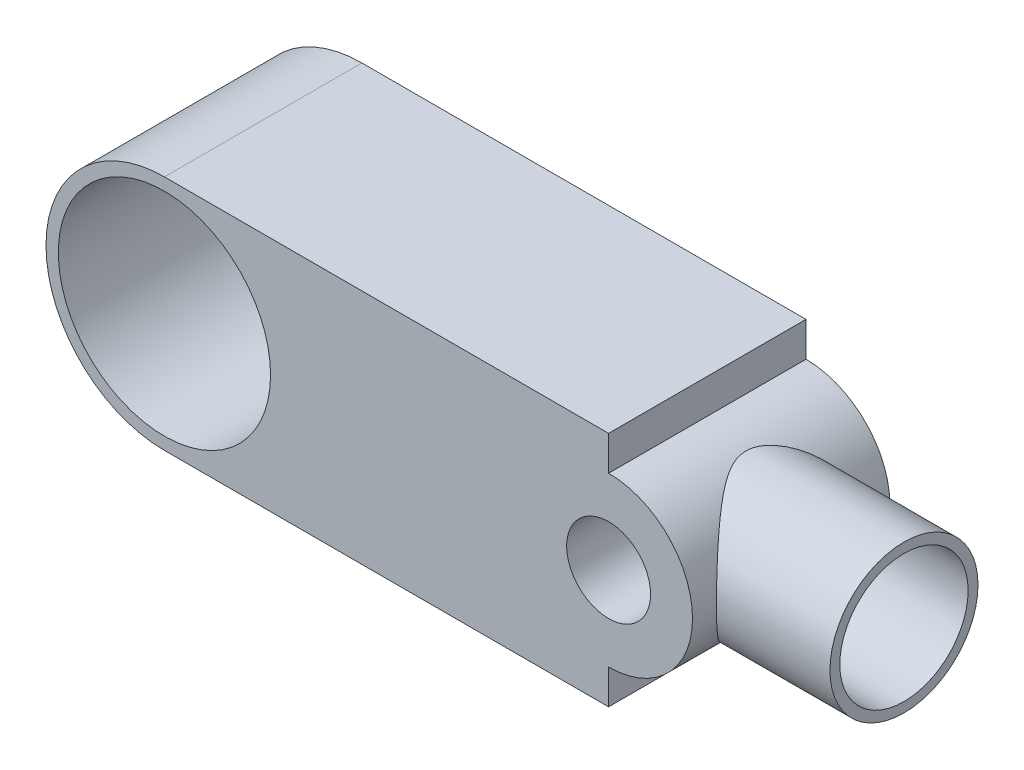
ISO-10303-21;
HEADER;
FILE_DESCRIPTION(('STEP AP214'),'2;1');
FILE_NAME('part.step','',(''),(''),'','','');
FILE_SCHEMA(('AUTOMOTIVE_DESIGN { 1 0 10303 214 1 1 1 1 }'));
ENDSEC;
DATA;
#1=APPLICATION_CONTEXT('core data for automotive mechanical design processes');
#2=APPLICATION_PROTOCOL_DEFINITION('international standard','automotive_design',2000,#1);
#3=PRODUCT_CONTEXT('',#1,'mechanical');
#4=PRODUCT('Part','Part','',(#3));
#5=PRODUCT_RELATED_PRODUCT_CATEGORY('part','',(#4));
#6=PRODUCT_DEFINITION_FORMATION('','',#4);
#7=PRODUCT_DEFINITION_CONTEXT('part definition',#1,'design');
#8=PRODUCT_DEFINITION('design','',#6,#7);
#9=PRODUCT_DEFINITION_SHAPE('','',#8);
#10=(LENGTH_UNIT() NAMED_UNIT(*) SI_UNIT(.MILLI.,.METRE.));
#11=(NAMED_UNIT(*) PLANE_ANGLE_UNIT() SI_UNIT($,.RADIAN.));
#12=(NAMED_UNIT(*) SI_UNIT($,.STERADIAN.) SOLID_ANGLE_UNIT());
#13=UNCERTAINTY_MEASURE_WITH_UNIT(LENGTH_MEASURE(1.E-05),#10,'distance_accuracy_value','');
#14=(GEOMETRIC_REPRESENTATION_CONTEXT(3) GLOBAL_UNCERTAINTY_ASSIGNED_CONTEXT((#13)) GLOBAL_UNIT_ASSIGNED_CONTEXT((#10,
#11,#12)) REPRESENTATION_CONTEXT('',''));
#15=CARTESIAN_POINT('',(0.,0.,0.));
#16=DIRECTION('',(0.,0.,1.));
#17=DIRECTION('',(1.,0.,0.));
#18=AXIS2_PLACEMENT_3D('',#15,#16,#17);
#19=CARTESIAN_POINT('',(0.,0.,40.));
#20=DIRECTION('',(0.,0.,-1.));
#21=DIRECTION('',(-1.,0.,0.));
#22=AXIS2_PLACEMENT_3D('',#19,#20,#21);
#23=CYLINDRICAL_SURFACE('',#22,17.);
#24=CARTESIAN_POINT('',(0.,0.,40.));
#25=DIRECTION('',(0.,0.,1.));
#26=DIRECTION('',(1.,0.,0.));
#27=AXIS2_PLACEMENT_3D('',#24,#25,#26);
#28=CIRCLE('',#27,17.);
#29=CARTESIAN_POINT('',(0.,-17.,40.));
#30=VERTEX_POINT('',#29);
#31=CARTESIAN_POINT('',(0.,17.,40.));
#32=VERTEX_POINT('',#31);
#33=EDGE_CURVE('E50',#30,#32,#28,.T.);
#34=ORIENTED_EDGE('',*,*,#33,.F.);
#35=DIRECTION('',(0.,0.,1.));
#36=VECTOR('',#35,1.);
#37=CARTESIAN_POINT('',(0.,-17.,0.));
#38=LINE('',#37,#36);
#39=CARTESIAN_POINT('',(0.,-17.,0.));
#40=VERTEX_POINT('',#39);
#41=EDGE_CURVE('E141',#40,#30,#38,.T.);
#42=ORIENTED_EDGE('',*,*,#41,.F.);
#43=CARTESIAN_POINT('',(0.,0.,0.));
#44=DIRECTION('',(0.,0.,1.));
#45=DIRECTION('',(1.,0.,0.));
#46=AXIS2_PLACEMENT_3D('',#43,#44,#45);
#47=CIRCLE('',#46,17.);
#48=CARTESIAN_POINT('',(0.,17.,0.));
#49=VERTEX_POINT('',#48);
#50=EDGE_CURVE('E45',#40,#49,#47,.T.);
#51=ORIENTED_EDGE('',*,*,#50,.T.);
#52=DIRECTION('',(0.,0.,1.));
#53=VECTOR('',#52,1.);
#54=CARTESIAN_POINT('',(0.,17.,0.));
#55=LINE('',#54,#53);
#56=EDGE_CURVE('E62',#49,#32,#55,.T.);
#57=ORIENTED_EDGE('',*,*,#56,.T.);
#58=EDGE_LOOP('',(#34,#42,#51,#57));
#59=FACE_BOUND('',#58,.T.);
#60=CARTESIAN_POINT('',(17.,0.,35.148533521579));
#61=CARTESIAN_POINT('',(16.9999991302981,-0.350062969028345,35.1485326365752));
#62=CARTESIAN_POINT('',(16.9891653444857,-0.700137947487223,35.1362576028503));
#63=CARTESIAN_POINT('',(16.9460807365506,-1.39725887284022,35.0874017384682));
#64=CARTESIAN_POINT('',(16.9138288534935,-1.74430466882253,35.0508197037761));
#65=CARTESIAN_POINT('',(16.8286230490111,-2.43264872335066,34.9540419460553));
#66=CARTESIAN_POINT('',(16.7756599565189,-2.77394436575743,34.8938357620491));
#67=CARTESIAN_POINT('',(16.6501724362022,-3.4480913826469,34.7509104252288));
#68=CARTESIAN_POINT('',(16.5776478083794,-3.78094267075591,34.6681910422382));
#69=CARTESIAN_POINT('',(16.4149921748408,-4.43402605306581,34.4821997809237));
#70=CARTESIAN_POINT('',(16.3249739977953,-4.75432399503505,34.379059535401));
#71=CARTESIAN_POINT('',(16.1286563009096,-5.38282947299204,34.1534129336591));
#72=CARTESIAN_POINT('',(16.0223571596618,-5.69103728991045,34.0309070277607));
#73=CARTESIAN_POINT('',(15.7951549284394,-6.29420048565358,33.7680522317252));
#74=CARTESIAN_POINT('',(15.6742496032193,-6.5891538265906,33.6277006104105));
#75=CARTESIAN_POINT('',(15.4195507686398,-7.16495750260025,33.3306571284931));
#76=CARTESIAN_POINT('',(15.2857544012181,-7.44580468911481,33.173961643667));
#77=CARTESIAN_POINT('',(14.9525647573555,-8.09955996417689,32.7815759695317));
#78=CARTESIAN_POINT('',(14.7479422301565,-8.46564473889133,32.5389147038629));
#79=CARTESIAN_POINT('',(14.3214041581488,-9.16878467175514,32.0280287184052));
#80=CARTESIAN_POINT('',(14.0994823766256,-9.50582926730369,31.7597947713264));
#81=CARTESIAN_POINT('',(13.6420314172314,-10.1514445290334,31.1998314355125));
#82=CARTESIAN_POINT('',(13.4064727396035,-10.4599494069001,30.9080505283112));
#83=CARTESIAN_POINT('',(12.9263257225329,-11.0478102432138,30.3035156680166));
#84=CARTESIAN_POINT('',(12.6817385891012,-11.3271700758846,29.9907645115816));
#85=CARTESIAN_POINT('',(12.1822165195919,-11.862995920558,29.3382831989957));
#86=CARTESIAN_POINT('',(11.9271723672962,-12.118818678642,28.9981092375766));
#87=CARTESIAN_POINT('',(11.416843540912,-12.6007468771702,28.2972835695232));
#88=CARTESIAN_POINT('',(11.1615588172992,-12.8268432683654,27.936625674831));
#89=CARTESIAN_POINT('',(10.6573293126381,-13.2487415055619,27.1949915507721));
#90=CARTESIAN_POINT('',(10.4083734410591,-13.4445999098557,26.814055091824));
#91=CARTESIAN_POINT('',(9.92433695372352,-13.8057374904692,26.0296892610917));
#92=CARTESIAN_POINT('',(9.6892463012846,-13.9710389758638,25.6262765810827));
#93=CARTESIAN_POINT('',(9.35346771382335,-14.1961760706847,24.9981919900579));
#94=CARTESIAN_POINT('',(9.24338032322282,-14.2679936455798,24.782824941109));
#95=CARTESIAN_POINT('',(9.03189446245701,-14.4027986616648,24.3451915706748));
#96=CARTESIAN_POINT('',(8.93049740995452,-14.4657846632138,24.1229241315482));
#97=CARTESIAN_POINT('',(8.64320574806638,-14.6405244256128,23.4457582502832));
#98=CARTESIAN_POINT('',(8.47369440351665,-14.7383969147046,22.9795723029301));
#99=CARTESIAN_POINT('',(8.28177765746332,-14.8464302757218,22.2991484913904));
#100=CARTESIAN_POINT('',(8.23105962403715,-14.8745472958986,22.095519328463));
#101=CARTESIAN_POINT('',(8.14361574939807,-14.9226003270876,21.684361748842));
#102=CARTESIAN_POINT('',(8.10688286865328,-14.9425404543912,21.4768353492005));
#103=CARTESIAN_POINT('',(8.049020955044,-14.9737890596324,21.0592557002418));
#104=CARTESIAN_POINT('',(8.02786981232692,-14.9851097689419,20.8492064628273));
#105=CARTESIAN_POINT('',(8.00211040879179,-14.9988815293899,20.4277921199078));
#106=CARTESIAN_POINT('',(7.997501837022,-15.0013327472488,20.2164270392117));
#107=CARTESIAN_POINT('',(8.00506897455629,-14.9972960116896,19.7938078760591));
#108=CARTESIAN_POINT('',(8.01726693450736,-14.9907962077642,19.5825543118883));
#109=CARTESIAN_POINT('',(8.05786994493661,-14.969009772177,19.1620870018145));
#110=CARTESIAN_POINT('',(8.08627547586044,-14.9537228800369,18.9528733165671));
#111=CARTESIAN_POINT('',(8.15803184472445,-14.9146965564452,18.5375016306632));
#112=CARTESIAN_POINT('',(8.20140716488379,-14.8909432766111,18.3313492162056));
#113=CARTESIAN_POINT('',(8.30134627140615,-14.8354612997649,17.9233335076197));
#114=CARTESIAN_POINT('',(8.35791490494853,-14.8037296711987,17.7214718197036));
#115=CARTESIAN_POINT('',(8.51706610661316,-14.7129873844161,17.211250310507));
#116=CARTESIAN_POINT('',(8.62770691794222,-14.6486370611905,16.9063454082258));
#117=CARTESIAN_POINT('',(8.86952026428829,-14.5034990689989,16.3088462313718));
#118=CARTESIAN_POINT('',(9.00070614300793,-14.4227007069885,16.0162601154707));
#119=CARTESIAN_POINT('',(9.27836676152409,-14.2456702640599,15.4420000592149));
#120=CARTESIAN_POINT('',(9.42489344972101,-14.1493851089534,15.1603679357136));
#121=CARTESIAN_POINT('',(9.72835616185364,-13.9424825635222,14.6083103098096));
#122=CARTESIAN_POINT('',(9.88529115544604,-13.8318665908091,14.3378837024393));
#123=CARTESIAN_POINT('',(10.1804578637767,-13.6156600777041,13.8498710218233));
#124=CARTESIAN_POINT('',(10.3176623988277,-13.5120993265881,13.63075570322));
#125=CARTESIAN_POINT('',(10.5954026984048,-13.2954314857213,13.1994523243595));
#126=CARTESIAN_POINT('',(10.7359388536213,-13.1823232723428,12.987265083545));
#127=CARTESIAN_POINT('',(11.1606029539076,-12.8287356223965,12.3604667303405));
#128=CARTESIAN_POINT('',(11.4476994284271,-12.5740558074001,11.9557596052157));
#129=CARTESIAN_POINT('',(12.0208366532807,-12.0273224846743,11.1723765914905));
#130=CARTESIAN_POINT('',(12.306878033562,-11.735297129089,10.7936814215095));
#131=CARTESIAN_POINT('',(12.8712541304774,-11.1133715589206,10.0627493328625));
#132=CARTESIAN_POINT('',(13.1495922259204,-10.7834882871164,9.71050069427968));
#133=CARTESIAN_POINT('',(13.6352711166348,-10.1588064131729,9.10562663820936));
#134=CARTESIAN_POINT('',(13.8452299529554,-9.87122544370551,8.84763207719246));
#135=CARTESIAN_POINT('',(14.2534887356309,-9.27197199196801,8.3509936345893));
#136=CARTESIAN_POINT('',(14.4517887268062,-8.9602996023235,8.11234967861192));
#137=CARTESIAN_POINT('',(14.833283063124,-8.31351209447092,7.65686727869284));
#138=CARTESIAN_POINT('',(15.0164996218003,-7.97843284370101,7.43999666163044));
#139=CARTESIAN_POINT('',(15.3648594721147,-7.28502088236289,7.03020490397535));
#140=CARTESIAN_POINT('',(15.530006822732,-6.92669342308836,6.83727838338367));
#141=CARTESIAN_POINT('',(15.8080238020619,-6.26171790979262,6.51405608322565));
#142=CARTESIAN_POINT('',(15.9247506285131,-5.95901665454972,6.37894325909598));
#143=CARTESIAN_POINT('',(16.1426788339558,-5.34053942929647,6.12747729411739));
#144=CARTESIAN_POINT('',(16.2438835377691,-5.02476627772608,6.01112013555238));
#145=CARTESIAN_POINT('',(16.4290396903629,-4.38161919970281,5.79875834295632));
#146=CARTESIAN_POINT('',(16.5129967455842,-4.05424908360266,5.70274709505662));
#147=CARTESIAN_POINT('',(16.6621164059827,-3.38966570504614,5.53252143838692));
#148=CARTESIAN_POINT('',(16.727278795266,-3.05245232956951,5.4583072799993));
#149=CARTESIAN_POINT('',(16.8377916386816,-2.36843789882078,5.33259170825764));
#150=CARTESIAN_POINT('',(16.8830202525202,-2.02159128989148,5.28122995693643));
#151=CARTESIAN_POINT('',(16.9520727976307,-1.32302801396549,5.20286135899246));
#152=CARTESIAN_POINT('',(16.9758966809555,-0.971311336061517,5.17585456692544));
#153=CARTESIAN_POINT('',(17.0015771358905,-0.26613484749739,5.14674455822591));
#154=CARTESIAN_POINT('',(17.0034393080259,0.0873244957576473,5.14463499247319));
#155=CARTESIAN_POINT('',(16.985164148193,0.792922684566801,5.16534874963734));
#156=CARTESIAN_POINT('',(16.9650282842637,1.14506161666499,5.18817040876894));
#157=CARTESIAN_POINT('',(16.9062081271185,1.81136667137754,5.25490762734186));
#158=CARTESIAN_POINT('',(16.8694882095085,2.12593530963243,5.29658994574143));
#159=CARTESIAN_POINT('',(16.7791527756365,2.74940671472676,5.39927711925535));
#160=CARTESIAN_POINT('',(16.7255385741825,3.0583099205029,5.46028047070039));
#161=CARTESIAN_POINT('',(16.6023435784895,3.66867092051007,5.60071760318556));
#162=CARTESIAN_POINT('',(16.5327606777443,3.97012772663522,5.68015381580635));
#163=CARTESIAN_POINT('',(16.3787584323192,4.56403361881577,5.85638315344701));
#164=CARTESIAN_POINT('',(16.2943381950834,4.85648216172494,5.95317732266039));
#165=CARTESIAN_POINT('',(16.1068854507353,5.4469629929748,6.16873573589989));
#166=CARTESIAN_POINT('',(16.0030839257848,5.7444156913472,6.28841639883531));
#167=CARTESIAN_POINT('',(15.7819015773923,6.32681856879558,6.54439563099222));
#168=CARTESIAN_POINT('',(15.664520647682,6.61176865000584,6.68069433026181));
#169=CARTESIAN_POINT('',(15.417731560136,7.16841994411667,6.96855099496842));
#170=CARTESIAN_POINT('',(15.2883233192127,7.44012106547047,7.12010906582143));
#171=CARTESIAN_POINT('',(15.0189965181811,7.969822616795,7.43722923511615));
#172=CARTESIAN_POINT('',(14.8790757677403,8.22782017234021,7.60279425288413));
#173=CARTESIAN_POINT('',(14.516012410579,8.85874937199631,8.0351253521801));
#174=CARTESIAN_POINT('',(14.2870289710183,9.22267284475824,8.31020279353306));
#175=CARTESIAN_POINT('',(13.8132735013541,9.91819968160604,8.88649630733359));
#176=CARTESIAN_POINT('',(13.5684943975407,10.2497883960733,9.18772411173995));
#177=CARTESIAN_POINT('',(13.0669523102988,10.8820118338008,9.81504739670171));
#178=CARTESIAN_POINT('',(12.8101451135638,11.1825167840915,10.1412379635457));
#179=CARTESIAN_POINT('',(12.2904006585737,11.7513577682343,10.8157825953698));
#180=CARTESIAN_POINT('',(12.0274647718476,12.0197009185084,11.1641317311271));
#181=CARTESIAN_POINT('',(11.4947027051461,12.5304051102611,11.8907661131831));
#182=CARTESIAN_POINT('',(11.224856949733,12.7720280241582,12.2695550992888));
#183=CARTESIAN_POINT('',(10.6909213339554,13.2221763666286,13.0508187728421));
#184=CARTESIAN_POINT('',(10.4268355663613,13.4306788825643,13.4533095955998));
#185=CARTESIAN_POINT('',(10.0429668901545,13.7172993091294,14.0750375087092));
#186=CARTESIAN_POINT('',(9.91732078601141,13.8083097234611,14.2847908508064));
#187=CARTESIAN_POINT('',(9.67141492354297,13.9816422969616,14.7110122493223));
#188=CARTESIAN_POINT('',(9.55115572938246,14.0639635473432,14.9274810050391));
#189=CARTESIAN_POINT('',(9.31808006013281,14.2194581116226,15.3671833577078));
#190=CARTESIAN_POINT('',(9.20525322625248,14.2926442905481,15.5904068781906));
#191=CARTESIAN_POINT('',(8.98918407704626,14.429515294593,16.0442385186253));
#192=CARTESIAN_POINT('',(8.88593853446644,14.4932033233819,16.2748441166237));
#193=CARTESIAN_POINT('',(8.70394654528928,14.6031218893045,16.7143656422531));
#194=CARTESIAN_POINT('',(8.62375124485427,14.6505398530233,16.9223809046087));
#195=CARTESIAN_POINT('',(8.4749736806385,14.7371039101608,17.344230595648));
#196=CARTESIAN_POINT('',(8.40639023442218,14.7762508459192,17.5580644292492));
#197=CARTESIAN_POINT('',(8.28334442065508,14.8455782182063,17.9906088517324));
#198=CARTESIAN_POINT('',(8.22884535051594,14.8757819903869,18.2093051188714));
#199=CARTESIAN_POINT('',(8.13605936268356,14.926732899921,18.6511784127804));
#200=CARTESIAN_POINT('',(8.09776777105855,14.9474827637359,18.8743541282893));
#201=CARTESIAN_POINT('',(8.03896940161493,14.9791895206198,19.3264561371635));
#202=CARTESIAN_POINT('',(8.0186774263672,14.9900281819808,19.5554192021718));
#203=CARTESIAN_POINT('',(7.99783747924545,15.0011580279249,20.0144960521085));
#204=CARTESIAN_POINT('',(7.99728802018044,15.0014500069828,20.2446097490546));
#205=CARTESIAN_POINT('',(8.01597265101576,14.991473869579,20.7040072834842));
#206=CARTESIAN_POINT('',(8.03522540300084,14.98119579164,20.9332901334171));
#207=CARTESIAN_POINT('',(8.09241364112727,14.9503804937031,21.3888055733944));
#208=CARTESIAN_POINT('',(8.13035246014266,14.9298414435339,21.6150376118934));
#209=CARTESIAN_POINT('',(8.23170957363801,14.8742358417849,22.1053019322918));
#210=CARTESIAN_POINT('',(8.2985910623264,14.8371555759993,22.368385266968));
#211=CARTESIAN_POINT('',(8.45199611068145,14.7503051018903,22.8867228011668));
#212=CARTESIAN_POINT('',(8.53853639933586,14.7005240811769,23.14197012128));
#213=CARTESIAN_POINT('',(8.72747444461087,14.5891476395478,23.6447141067762));
#214=CARTESIAN_POINT('',(8.82991955031208,14.5275168063499,23.892184886373));
#215=CARTESIAN_POINT('',(9.0468819621408,14.3934093151854,24.3785909734333));
#216=CARTESIAN_POINT('',(9.16139648015043,14.3209351604852,24.6175282351976));
#217=CARTESIAN_POINT('',(9.49290739149433,14.1049174655336,25.2716573795216));
#218=CARTESIAN_POINT('',(9.71985257727185,13.9502077034024,25.6781430209714));
#219=CARTESIAN_POINT('',(10.1901800464178,13.6104635759935,26.4683712104822));
#220=CARTESIAN_POINT('',(10.433574545601,13.4254065250331,26.8520964498721));
#221=CARTESIAN_POINT('',(10.9285645573822,13.0256617571436,27.5991567891494));
#222=CARTESIAN_POINT('',(11.1801715401568,12.8109311136437,27.9624612569189));
#223=CARTESIAN_POINT('',(11.684849027749,12.352352344981,28.6688999435969));
#224=CARTESIAN_POINT('',(11.9379191180214,12.1085121164229,29.012039595127));
#225=CARTESIAN_POINT('',(12.4583017864451,11.5732330742054,29.7017542982602));
#226=CARTESIAN_POINT('',(12.7253592973386,11.2796496820607,30.0468632451193));
#227=CARTESIAN_POINT('',(13.2500802136358,10.658366232418,30.7129371864564));
#228=CARTESIAN_POINT('',(13.507741612173,10.3306589435345,31.0338970384402));
#229=CARTESIAN_POINT('',(14.0078417249106,9.64163873180934,31.6485966646657));
#230=CARTESIAN_POINT('',(14.2503142372929,9.28040520840542,31.9423976205482));
#231=CARTESIAN_POINT('',(14.7153421909371,8.52382877790176,32.5002539537243));
#232=CARTESIAN_POINT('',(14.9379070841878,8.12850223492239,32.7643234628621));
#233=CARTESIAN_POINT('',(15.294884223302,7.42776205419934,33.1847069485015));
#234=CARTESIAN_POINT('',(15.4357652821708,7.13077868954108,33.3496414553343));
#235=CARTESIAN_POINT('',(15.7030412895692,6.52113419191825,33.6611912285701));
#236=CARTESIAN_POINT('',(15.8294401068934,6.20847727822892,33.8078113884272));
#237=CARTESIAN_POINT('',(16.0656707890401,5.56869984724502,34.0808866166242));
#238=CARTESIAN_POINT('',(16.1755144631712,5.24158985725101,34.2073560628249));
#239=CARTESIAN_POINT('',(16.3767547419221,4.57420199097105,34.4384363555683));
#240=CARTESIAN_POINT('',(16.4681527277819,4.23392510291732,34.543048838813));
#241=CARTESIAN_POINT('',(16.6225670274187,3.57667736474082,34.7194416370989));
#242=CARTESIAN_POINT('',(16.6875023306659,3.26075585002567,34.7934529169988));
#243=CARTESIAN_POINT('',(16.7997484070706,2.6217638510421,34.9212272511512));
#244=CARTESIAN_POINT('',(16.8470607128001,2.29869399101453,34.9749920661282));
#245=CARTESIAN_POINT('',(16.9231397987153,1.6476406966443,35.0613830149642));
#246=CARTESIAN_POINT('',(16.9519107963098,1.31965839706571,35.0940139559457));
#247=CARTESIAN_POINT('',(16.9903418211158,0.66112105950591,35.1375902098252));
#248=CARTESIAN_POINT('',(17.000000821263,0.330565884218595,35.1485343572916));
#249=CARTESIAN_POINT('',(17.,0.,35.148533521579));
#250=B_SPLINE_CURVE_WITH_KNOTS('',3,(#60,#61,#62,#63,#64,#65,#66,#67,#68,#69,#70,#71,#72,#73,
#74,#75,#76,#77,#78,#79,#80,#81,#82,#83,#84,#85,#86,#87,#88,#89,#90,#91,#92,#93,#94,#95,#96,#97,
#98,#99,#100,#101,#102,#103,#104,#105,#106,#107,#108,#109,#110,#111,#112,#113,#114,#115,#116,
#117,#118,#119,#120,#121,#122,#123,#124,#125,#126,#127,#128,#129,#130,#131,#132,#133,#134,#135,
#136,#137,#138,#139,#140,#141,#142,#143,#144,#145,#146,#147,#148,#149,#150,#151,#152,#153,#154,
#155,#156,#157,#158,#159,#160,#161,#162,#163,#164,#165,#166,#167,#168,#169,#170,#171,#172,#173,
#174,#175,#176,#177,#178,#179,#180,#181,#182,#183,#184,#185,#186,#187,#188,#189,#190,#191,#192,
#193,#194,#195,#196,#197,#198,#199,#200,#201,#202,#203,#204,#205,#206,#207,#208,#209,#210,#211,
#212,#213,#214,#215,#216,#217,#218,#219,#220,#221,#222,#223,#224,#225,#226,#227,#228,#229,#230,
#231,#232,#233,#234,#235,#236,#237,#238,#239,#240,#241,#242,#243,#244,#245,#246,#247,#248,#249),
.UNSPECIFIED.,.T.,.F.,(4,2,2,2,2,2,2,2,2,2,2,2,2,2,2,2,2,2,2,2,2,2,2,2,2,2,2,2,2,2,2,2,2,2,2,2,
2,2,2,2,2,2,2,2,2,2,2,2,2,2,2,2,2,2,2,2,2,2,2,2,2,2,2,2,2,2,2,2,2,2,2,2,2,2,2,2,2,2,2,2,2,2,2,2,
2,2,2,2,2,2,2,2,2,2,4),(0.,1.04983122895355,2.09971446463749,3.15006312327509,4.20042252115222,
5.2442196797098,6.28799256982264,7.33192539569681,8.37609020599624,9.82756320987206,
11.2795619396223,12.7348284259106,14.1899012178372,15.677166551523,17.1648835927934,
18.6497833283075,20.1335946453903,20.8901435420877,21.6468156213176,23.1568453166834,
23.7915095252772,24.4258538471675,25.0592963173279,25.6927268805685,26.3269968669096,
26.9612856560735,27.5966167422559,28.2321816156875,29.2225436686263,30.2135516344888,
31.2080311911267,32.2024124483452,33.0376243089539,33.8729346019252,35.5440840831346,
37.213981148687,38.8831337684172,40.201159091025,41.5191793464004,42.8352224588034,
44.1509693320715,45.2042922009838,46.257389133234,47.3101432071265,48.3629093734943,
49.4220239734377,50.4811409458195,51.5399878236041,52.59876404356,53.5559849379857,
54.5131313545014,55.4704041053452,56.4277344616746,57.4377913533395,58.4478561499351,
59.4579279248193,60.4682107398368,61.9972566076592,63.5269920389765,65.0628760657068,
66.5984196184375,68.1692239877838,69.7411103484526,70.5235694969229,71.3061104007536,
72.0875365014595,72.8686984327688,73.5520272647314,74.2352864713885,74.9167467928138,
75.5980104597923,76.2872988222182,76.9765352608884,77.6664218484214,78.3564315297116,
79.1770257678425,79.9983209378766,80.8221097462115,81.6457086690006,83.1151155774282,
84.5856259695311,86.0582863532865,87.5305481499777,89.1066964213325,90.6831793854494,
92.2560196978404,93.8281092288635,94.9304484585073,96.0324925185833,97.1337466966156,
98.2349183805079,99.2265368749605,100.218069113843,101.20937573897,102.200735634713),.UNSPECIFIED.);
#251=CARTESIAN_POINT('',(17.,0.,35.148533521579));
#252=VERTEX_POINT('',#251);
#253=EDGE_CURVE('E11',#252,#252,#250,.T.);
#254=ORIENTED_EDGE('',*,*,#253,.F.);
#255=EDGE_LOOP('',(#254));
#256=FACE_BOUND('',#255,.T.);
#257=ADVANCED_FACE('F40',(#59,#256),#23,.T.);
#258=CARTESIAN_POINT('',(0.,0.,2.));
#259=DIRECTION('',(0.,0.,1.));
#260=DIRECTION('',(1.,0.,0.));
#261=AXIS2_PLACEMENT_3D('',#258,#259,#260);
#262=CYLINDRICAL_SURFACE('',#261,8.5);
#263=CARTESIAN_POINT('',(0.,0.,0.));
#264=DIRECTION('',(0.,0.,-1.));
#265=DIRECTION('',(-1.,0.,0.));
#266=AXIS2_PLACEMENT_3D('',#263,#264,#265);
#267=CIRCLE('',#266,8.5);
#268=CARTESIAN_POINT('',(-8.5,0.,0.));
#269=VERTEX_POINT('',#268);
#270=EDGE_CURVE('E161',#269,#269,#267,.T.);
#271=ORIENTED_EDGE('',*,*,#270,.T.);
#272=EDGE_LOOP('',(#271));
#273=FACE_BOUND('',#272,.T.);
#274=CARTESIAN_POINT('',(0.,0.,40.));
#275=DIRECTION('',(0.,0.,1.));
#276=DIRECTION('',(1.,0.,0.));
#277=AXIS2_PLACEMENT_3D('',#274,#275,#276);
#278=CIRCLE('',#277,8.5);
#279=CARTESIAN_POINT('',(8.5,0.,40.));
#280=VERTEX_POINT('',#279);
#281=EDGE_CURVE('E352',#280,#280,#278,.T.);
#282=ORIENTED_EDGE('',*,*,#281,.T.);
#283=EDGE_LOOP('',(#282));
#284=FACE_BOUND('',#283,.T.);
#285=ADVANCED_FACE('F182',(#273,#284),#262,.F.);
#286=CARTESIAN_POINT('',(0.,0.,40.));
#287=DIRECTION('',(0.,0.,1.));
#288=DIRECTION('',(1.,0.,0.));
#289=AXIS2_PLACEMENT_3D('',#286,#287,#288);
#290=PLANE('',#289);
#291=CARTESIAN_POINT('',(-90.,0.,40.));
#292=DIRECTION('',(0.,0.,1.));
#293=DIRECTION('',(1.,0.,0.));
#294=AXIS2_PLACEMENT_3D('',#291,#292,#293);
#295=CIRCLE('',#294,21.5);
#296=CARTESIAN_POINT('',(-68.5,0.,40.));
#297=VERTEX_POINT('',#296);
#298=EDGE_CURVE('E122',#297,#297,#295,.T.);
#299=ORIENTED_EDGE('',*,*,#298,.F.);
#300=EDGE_LOOP('',(#299));
#301=FACE_BOUND('',#300,.T.);
#302=ORIENTED_EDGE('',*,*,#281,.F.);
#303=EDGE_LOOP('',(#302));
#304=FACE_BOUND('',#303,.T.);
#305=ORIENTED_EDGE('',*,*,#33,.T.);
#306=DIRECTION('',(0.,-1.,0.));
#307=VECTOR('',#306,1.);
#308=CARTESIAN_POINT('',(0.,0.,40.));
#309=LINE('',#308,#307);
#310=CARTESIAN_POINT('',(0.,24.,40.));
#311=VERTEX_POINT('',#310);
#312=EDGE_CURVE('E132',#311,#32,#309,.T.);
#313=ORIENTED_EDGE('',*,*,#312,.F.);
#314=DIRECTION('',(1.,0.,0.));
#315=VECTOR('',#314,1.);
#316=CARTESIAN_POINT('',(0.,24.,40.));
#317=LINE('',#316,#315);
#318=CARTESIAN_POINT('',(-90.,24.,40.));
#319=VERTEX_POINT('',#318);
#320=EDGE_CURVE('E109',#319,#311,#317,.T.);
#321=ORIENTED_EDGE('',*,*,#320,.F.);
#322=CARTESIAN_POINT('',(-90.,0.,40.));
#323=DIRECTION('',(0.,0.,1.));
#324=DIRECTION('',(1.,0.,0.));
#325=AXIS2_PLACEMENT_3D('',#322,#323,#324);
#326=CIRCLE('',#325,24.);
#327=CARTESIAN_POINT('',(-90.,-24.,40.));
#328=VERTEX_POINT('',#327);
#329=EDGE_CURVE('E136',#319,#328,#326,.T.);
#330=ORIENTED_EDGE('',*,*,#329,.T.);
#331=DIRECTION('',(1.,0.,0.));
#332=VECTOR('',#331,1.);
#333=CARTESIAN_POINT('',(0.,-24.,40.));
#334=LINE('',#333,#332);
#335=CARTESIAN_POINT('',(0.,-24.,40.));
#336=VERTEX_POINT('',#335);
#337=EDGE_CURVE('E119',#328,#336,#334,.T.);
#338=ORIENTED_EDGE('',*,*,#337,.T.);
#339=DIRECTION('',(0.,1.,0.));
#340=VECTOR('',#339,1.);
#341=CARTESIAN_POINT('',(0.,0.,40.));
#342=LINE('',#341,#340);
#343=EDGE_CURVE('E116',#336,#30,#342,.T.);
#344=ORIENTED_EDGE('',*,*,#343,.T.);
#345=EDGE_LOOP('',(#305,#313,#321,#330,#338,#344));
#346=FACE_BOUND('',#345,.T.);
#347=ADVANCED_FACE('F185',(#301,#304,#346),#290,.T.);
#348=CARTESIAN_POINT('',(0.,0.,0.));
#349=DIRECTION('',(0.,0.,1.));
#350=DIRECTION('',(1.,0.,0.));
#351=AXIS2_PLACEMENT_3D('',#348,#349,#350);
#352=PLANE('',#351);
#353=CARTESIAN_POINT('',(-90.,0.,0.));
#354=DIRECTION('',(0.,0.,1.));
#355=DIRECTION('',(1.,0.,0.));
#356=AXIS2_PLACEMENT_3D('',#353,#354,#355);
#357=CIRCLE('',#356,5.);
#358=CARTESIAN_POINT('',(-85.,0.,0.));
#359=VERTEX_POINT('',#358);
#360=EDGE_CURVE('E242',#359,#359,#357,.T.);
#361=ORIENTED_EDGE('',*,*,#360,.T.);
#362=EDGE_LOOP('',(#361));
#363=FACE_BOUND('',#362,.T.);
#364=ORIENTED_EDGE('',*,*,#270,.F.);
#365=EDGE_LOOP('',(#364));
#366=FACE_BOUND('',#365,.T.);
#367=ORIENTED_EDGE('',*,*,#50,.F.);
#368=DIRECTION('',(0.,1.,0.));
#369=VECTOR('',#368,1.);
#370=CARTESIAN_POINT('',(0.,0.,0.));
#371=LINE('',#370,#369);
#372=CARTESIAN_POINT('',(0.,-24.,0.));
#373=VERTEX_POINT('',#372);
#374=EDGE_CURVE('E129',#373,#40,#371,.T.);
#375=ORIENTED_EDGE('',*,*,#374,.F.);
#376=DIRECTION('',(1.,0.,0.));
#377=VECTOR('',#376,1.);
#378=CARTESIAN_POINT('',(0.,-24.,0.));
#379=LINE('',#378,#377);
#380=CARTESIAN_POINT('',(-90.,-24.,0.));
#381=VERTEX_POINT('',#380);
#382=EDGE_CURVE('E126',#381,#373,#379,.T.);
#383=ORIENTED_EDGE('',*,*,#382,.F.);
#384=CARTESIAN_POINT('',(-90.,0.,0.));
#385=DIRECTION('',(0.,0.,1.));
#386=DIRECTION('',(1.,0.,0.));
#387=AXIS2_PLACEMENT_3D('',#384,#385,#386);
#388=CIRCLE('',#387,24.);
#389=CARTESIAN_POINT('',(-90.,24.,0.));
#390=VERTEX_POINT('',#389);
#391=EDGE_CURVE('E102',#390,#381,#388,.T.);
#392=ORIENTED_EDGE('',*,*,#391,.F.);
#393=DIRECTION('',(1.,0.,0.));
#394=VECTOR('',#393,1.);
#395=CARTESIAN_POINT('',(0.,24.,0.));
#396=LINE('',#395,#394);
#397=CARTESIAN_POINT('',(0.,24.,0.));
#398=VERTEX_POINT('',#397);
#399=EDGE_CURVE('E95',#390,#398,#396,.T.);
#400=ORIENTED_EDGE('',*,*,#399,.T.);
#401=DIRECTION('',(0.,-1.,0.));
#402=VECTOR('',#401,1.);
#403=CARTESIAN_POINT('',(0.,0.,0.));
#404=LINE('',#403,#402);
#405=EDGE_CURVE('E99',#398,#49,#404,.T.);
#406=ORIENTED_EDGE('',*,*,#405,.T.);
#407=EDGE_LOOP('',(#367,#375,#383,#392,#400,#406));
#408=FACE_BOUND('',#407,.T.);
#409=ADVANCED_FACE('F97',(#363,#366,#408),#352,.F.);
#410=CARTESIAN_POINT('',(40.,0.,20.148533521579));
#411=DIRECTION('',(-1.,0.,0.));
#412=DIRECTION('',(0.,0.,1.));
#413=AXIS2_PLACEMENT_3D('',#410,#411,#412);
#414=CYLINDRICAL_SURFACE('',#413,15.);
#415=CARTESIAN_POINT('',(40.,0.,20.148533521579));
#416=DIRECTION('',(1.,0.,0.));
#417=DIRECTION('',(0.,0.,-1.));
#418=AXIS2_PLACEMENT_3D('',#415,#416,#417);
#419=CIRCLE('',#418,15.);
#420=CARTESIAN_POINT('',(40.,0.,5.14853352157895));
#421=VERTEX_POINT('',#420);
#422=EDGE_CURVE('E152',#421,#421,#419,.T.);
#423=ORIENTED_EDGE('',*,*,#422,.F.);
#424=EDGE_LOOP('',(#423));
#425=FACE_BOUND('',#424,.T.);
#426=ORIENTED_EDGE('',*,*,#253,.T.);
#427=EDGE_LOOP('',(#426));
#428=FACE_BOUND('',#427,.T.);
#429=ADVANCED_FACE('F173',(#425,#428),#414,.T.);
#430=CARTESIAN_POINT('',(40.,0.,20.148533521579));
#431=DIRECTION('',(-1.,0.,0.));
#432=DIRECTION('',(0.,0.,1.));
#433=AXIS2_PLACEMENT_3D('',#430,#431,#432);
#434=CYLINDRICAL_SURFACE('',#433,13.);
#435=CARTESIAN_POINT('',(40.,0.,20.148533521579));
#436=DIRECTION('',(1.,0.,0.));
#437=DIRECTION('',(0.,0.,-1.));
#438=AXIS2_PLACEMENT_3D('',#435,#436,#437);
#439=CIRCLE('',#438,13.);
#440=CARTESIAN_POINT('',(40.,0.,7.14853352157895));
#441=VERTEX_POINT('',#440);
#442=EDGE_CURVE('E143',#441,#441,#439,.T.);
#443=ORIENTED_EDGE('',*,*,#442,.T.);
#444=EDGE_LOOP('',(#443));
#445=FACE_BOUND('',#444,.T.);
#446=CARTESIAN_POINT('',(17.,0.,33.148533521579));
#447=CARTESIAN_POINT('',(16.9999999593681,-0.316074841986615,33.1485334775138));
#448=CARTESIAN_POINT('',(16.9911669301447,-0.63215015594173,33.1369889612));
#449=CARTESIAN_POINT('',(16.956042788192,-1.26177496453516,33.0910064814557));
#450=CARTESIAN_POINT('',(16.9297444904566,-1.57532336587788,33.0565590960475));
#451=CARTESIAN_POINT('',(16.8602546489747,-2.19773354187861,32.9652828118273));
#452=CARTESIAN_POINT('',(16.8170368479837,-2.50658725320358,32.9084191243751));
#453=CARTESIAN_POINT('',(16.7146988614328,-3.11681921549184,32.773235756415));
#454=CARTESIAN_POINT('',(16.6555800524566,-3.41819811109998,32.6949179332258));
#455=CARTESIAN_POINT('',(16.5230966029181,-4.00981767289043,32.5185008642513));
#456=CARTESIAN_POINT('',(16.4498190187942,-4.30011404334134,32.4205223687813));
#457=CARTESIAN_POINT('',(16.2902208579189,-4.8699344228344,32.2057495756615));
#458=CARTESIAN_POINT('',(16.2039000345307,-5.14945822805085,32.0889549222111));
#459=CARTESIAN_POINT('',(16.0197961709039,-5.69643513828738,31.8378941151679));
#460=CARTESIAN_POINT('',(15.9220182059912,-5.96389351591629,31.7036356948575));
#461=CARTESIAN_POINT('',(15.7165273803661,-6.48610380141161,31.4188024695135));
#462=CARTESIAN_POINT('',(15.6088108207666,-6.74085092368753,31.2682215860077));
#463=CARTESIAN_POINT('',(15.3746513520778,-7.26006741101371,30.9371780892978));
#464=CARTESIAN_POINT('',(15.2473988334846,-7.52322913597028,30.7552384346556));
#465=CARTESIAN_POINT('',(14.9851026108755,-8.03298686979916,30.3745947134335));
#466=CARTESIAN_POINT('',(14.8500587147846,-8.27958246995472,30.1758902335072));
#467=CARTESIAN_POINT('',(14.574106898897,-8.75621742548683,29.7624986135828));
#468=CARTESIAN_POINT('',(14.4331907189982,-8.98623212578057,29.5477886005109));
#469=CARTESIAN_POINT('',(14.1478985380875,-9.42901527625571,29.103533075368));
#470=CARTESIAN_POINT('',(14.0035231278869,-9.6417866446497,28.8739900854563));
#471=CARTESIAN_POINT('',(13.68292963961,-10.0930330993844,28.35060656637));
#472=CARTESIAN_POINT('',(13.5064263546134,-10.3274459715326,28.0534253031337));
#473=CARTESIAN_POINT('',(13.156051279676,-10.7702384141026,27.4386314929121));
#474=CARTESIAN_POINT('',(12.9821803216449,-10.9786098994659,27.1210126468146));
#475=CARTESIAN_POINT('',(12.6424167972708,-11.3682024587805,26.4658992973148));
#476=CARTESIAN_POINT('',(12.4765174063463,-11.5494470481657,26.12842236602));
#477=CARTESIAN_POINT('',(12.1587438726127,-11.8835190859981,25.4334615109241));
#478=CARTESIAN_POINT('',(12.0068617265043,-12.0363628013932,25.0759891933347));
#479=CARTESIAN_POINT('',(11.7743126905905,-12.263030279025,24.4708681302285));
#480=CARTESIAN_POINT('',(11.6874111252253,-12.3457196750048,24.228910454055));
#481=CARTESIAN_POINT('',(11.5248869868341,-12.4975735117393,23.7369755095278));
#482=CARTESIAN_POINT('',(11.449266397331,-12.5667355746597,23.4869968402177));
#483=CARTESIAN_POINT('',(11.31190382728,-12.6905233811291,22.9802298727397));
#484=CARTESIAN_POINT('',(11.2501355259823,-12.7451767296594,22.7234555434749));
#485=CARTESIAN_POINT('',(11.1427117311917,-12.8392011553103,22.2039039618202));
#486=CARTESIAN_POINT('',(11.0970477384928,-12.8785802946428,21.9411299540237));
#487=CARTESIAN_POINT('',(11.0234596989126,-12.9416279052585,21.4082896531682));
#488=CARTESIAN_POINT('',(10.995731142586,-12.9651233702637,21.1381753781197));
#489=CARTESIAN_POINT('',(10.9602335105113,-12.9951465870987,20.5956880119536));
#490=CARTESIAN_POINT('',(10.9524636358617,-13.0016750180811,20.3233150116857));
#491=CARTESIAN_POINT('',(10.9573056467035,-12.9975943944208,19.7788417468945));
#492=CARTESIAN_POINT('',(10.9699206653646,-12.9869827053319,19.5067415307305));
#493=CARTESIAN_POINT('',(11.0148558784639,-12.9488920713135,18.9653872748502));
#494=CARTESIAN_POINT('',(11.0471761502397,-12.9214130601846,18.6961332463084));
#495=CARTESIAN_POINT('',(11.1248672649512,-12.8545552869738,18.1949814896475));
#496=CARTESIAN_POINT('',(11.1681822338133,-12.8170218733538,17.9625105379774));
#497=CARTESIAN_POINT('',(11.2672584084985,-12.7300132423892,17.5024765361271));
#498=CARTESIAN_POINT('',(11.3230240272174,-12.6805337904913,17.2749152575249));
#499=CARTESIAN_POINT('',(11.5065528874295,-12.5150442690794,16.6006018932176));
#500=CARTESIAN_POINT('',(11.6505340567459,-12.3819945806483,16.1623042709058));
#501=CARTESIAN_POINT('',(11.9402302712928,-12.1022318238313,15.386688636327));
#502=CARTESIAN_POINT('',(12.081217218971,-11.9620021068291,15.045137414953));
#503=CARTESIAN_POINT('',(12.3769714693622,-11.6557244164412,14.3798096045233));
#504=CARTESIAN_POINT('',(12.5317462552688,-11.4896623859258,14.0560428237705));
#505=CARTESIAN_POINT('',(12.8498754390817,-11.1327442171738,13.4259268622816));
#506=CARTESIAN_POINT('',(13.0132473885697,-10.9418360841305,13.119616200586));
#507=CARTESIAN_POINT('',(13.3436550416061,-10.5363783274217,12.5252733352105));
#508=CARTESIAN_POINT('',(13.5106901351989,-10.3218326161016,12.237238119092));
#509=CARTESIAN_POINT('',(13.8496462299233,-9.86261857259184,11.6711727031651));
#510=CARTESIAN_POINT('',(14.0215589708675,-9.61722508517114,11.3937253870054));
#511=CARTESIAN_POINT('',(14.3612267256239,-9.10221604205871,10.8594362063371));
#512=CARTESIAN_POINT('',(14.5289813169447,-8.83259803778722,10.6025964297874));
#513=CARTESIAN_POINT('',(14.8564005983472,-8.27001374910083,10.1112974675507));
#514=CARTESIAN_POINT('',(15.0160779227314,-7.97708589673322,9.87680278810744));
#515=CARTESIAN_POINT('',(15.3240725433369,-7.36811757935672,9.43158325051136));
#516=CARTESIAN_POINT('',(15.4723924607189,-7.05208248035184,9.22085290248119));
#517=CARTESIAN_POINT('',(15.7278306064449,-6.45904244742772,8.86237602567552));
#518=CARTESIAN_POINT('',(15.8374684000317,-6.18578226232034,8.71021894583697));
#519=CARTESIAN_POINT('',(16.0450410807174,-5.62546615715684,8.42449910615624));
#520=CARTESIAN_POINT('',(16.1429783448146,-5.33841305584588,8.29093256867541));
#521=CARTESIAN_POINT('',(16.325302613854,-4.75171735010897,8.04388774322502));
#522=CARTESIAN_POINT('',(16.4096939087028,-4.45207876948792,7.93040309430148));
#523=CARTESIAN_POINT('',(16.5632285428797,-3.84167701434563,7.72495915803375));
#524=CARTESIAN_POINT('',(16.6323717286967,-3.53091372786238,7.63300008739898));
#525=CARTESIAN_POINT('',(16.7542778339616,-2.89805475358495,7.47144166197287));
#526=CARTESIAN_POINT('',(16.8069228148347,-2.57589501119098,7.40200317946764));
#527=CARTESIAN_POINT('',(16.8938745120876,-1.92480043838614,7.28757002945841));
#528=CARTESIAN_POINT('',(16.9281811593303,-1.59586558243734,7.24257545411013));
#529=CARTESIAN_POINT('',(16.9775503618269,-0.934227332869199,7.17788767869173));
#530=CARTESIAN_POINT('',(16.9926217707765,-0.60152574421759,7.15818283810747));
#531=CARTESIAN_POINT('',(17.0031400138719,0.0647011105331101,7.14442673200647));
#532=CARTESIAN_POINT('',(16.9985887532436,0.398226293524338,7.15037297594621));
#533=CARTESIAN_POINT('',(16.9716081995528,1.02553863298746,7.18567934038717));
#534=CARTESIAN_POINT('',(16.9512486041349,1.31957361255843,7.21232907264895));
#535=CARTESIAN_POINT('',(16.8956166062867,1.90373453750885,7.28531385732104));
#536=CARTESIAN_POINT('',(16.8603455324716,2.19386082877718,7.33164715592416));
#537=CARTESIAN_POINT('',(16.7755972048896,2.76833185096049,7.44333839250759));
#538=CARTESIAN_POINT('',(16.7261183776754,3.05267593778451,7.50869843762892));
#539=CARTESIAN_POINT('',(16.6139019745696,3.61388561325894,7.65757162079674));
#540=CARTESIAN_POINT('',(16.5511637804418,3.89075085251868,7.74108560530085));
#541=CARTESIAN_POINT('',(16.4120737834293,4.4414160124999,7.92723740554959));
#542=CARTESIAN_POINT('',(16.335460051748,4.71502445641021,8.03024527072882));
#543=CARTESIAN_POINT('',(16.1708715865656,5.25184082235924,8.25304246623859));
#544=CARTESIAN_POINT('',(16.082892819761,5.51504500854486,8.37283775549447));
#545=CARTESIAN_POINT('',(15.8040523351076,6.28737647291293,8.75560713174945));
#546=CARTESIAN_POINT('',(15.5981799061844,6.77963170224763,9.04210526669394));
#547=CARTESIAN_POINT('',(15.1220691942748,7.78997308181915,9.72045107713483));
#548=CARTESIAN_POINT('',(14.8468081680652,8.2992378431364,10.1218545557282));
#549=CARTESIAN_POINT('',(14.4185993373104,9.01005006968501,10.7718378175725));
#550=CARTESIAN_POINT('',(14.2731111769979,9.23840197824427,10.9968020859716));
#551=CARTESIAN_POINT('',(13.9794031364879,9.67707937988469,11.461975661133));
#552=CARTESIAN_POINT('',(13.831183861753,9.88740881132588,11.7021816171354));
#553=CARTESIAN_POINT('',(13.5043336999225,10.3307032818153,12.2476479708621));
#554=CARTESIAN_POINT('',(13.325645838787,10.559577727749,12.5562063687134));
#555=CARTESIAN_POINT('',(12.9727083049806,10.9902846703487,13.1942655179927));
#556=CARTESIAN_POINT('',(12.7984602057806,11.192107684933,13.5237735533408));
#557=CARTESIAN_POINT('',(12.4604444793563,11.567236205172,14.2030004958926));
#558=CARTESIAN_POINT('',(12.2966608344722,11.7405859656958,14.552686875173));
#559=CARTESIAN_POINT('',(11.9862367707321,12.0573316744021,15.2725552912216));
#560=CARTESIAN_POINT('',(11.8395841815639,12.2007489450296,15.6427224990032));
#561=CARTESIAN_POINT('',(11.6225936943532,12.4067919326084,16.2583857126598));
#562=CARTESIAN_POINT('',(11.5444307550799,12.4794106654809,16.4978139594982));
#563=CARTESIAN_POINT('',(11.4000789209164,12.6114138673392,16.9837909359774));
#564=CARTESIAN_POINT('',(11.3338859107709,12.6708028863281,17.2303371845184));
#565=CARTESIAN_POINT('',(11.215803591257,12.7754444461521,17.7292681945947));
#566=CARTESIAN_POINT('',(11.1638857108412,12.8207252485292,17.9816401818051));
#567=CARTESIAN_POINT('',(11.0762387873222,12.8965230941636,18.4914057211216));
#568=CARTESIAN_POINT('',(11.0405096226576,12.9270402482816,18.7487992355059));
#569=CARTESIAN_POINT('',(10.9866371624098,12.9728594598171,19.2689697892226));
#570=CARTESIAN_POINT('',(10.9686421731724,12.9880332314384,19.5317737727672));
#571=CARTESIAN_POINT('',(10.9516602210817,13.0023562048661,20.0584291039376));
#572=CARTESIAN_POINT('',(10.9526724390402,13.001506097283,20.3222804059352));
#573=CARTESIAN_POINT('',(10.9736588951475,12.9837973301394,20.8488609033395));
#574=CARTESIAN_POINT('',(10.9936462965046,12.966927557631,21.1115891926059));
#575=CARTESIAN_POINT('',(11.0516052555817,12.9175636300315,21.633561992175));
#576=CARTESIAN_POINT('',(11.0895790776614,12.8850675076887,21.8928060596125));
#577=CARTESIAN_POINT('',(11.1879793969963,12.7997617507945,22.440442081574));
#578=CARTESIAN_POINT('',(11.2507341141594,12.7448122641517,22.7280801982312));
#579=CARTESIAN_POINT('',(11.3940088856773,12.6168835480378,23.2947519075782));
#580=CARTESIAN_POINT('',(11.4745320924929,12.5439011189116,23.5737839633673));
#581=CARTESIAN_POINT('',(11.6501846345508,12.3809354156207,24.1227779392823));
#582=CARTESIAN_POINT('',(11.7453454831513,12.2909153624674,24.3927187209796));
#583=CARTESIAN_POINT('',(11.9469576827212,12.0950390109506,24.9223985161798));
#584=CARTESIAN_POINT('',(12.0534100489599,11.9891812882019,25.1821366094327));
#585=CARTESIAN_POINT('',(12.31990873686,11.7162075151842,25.7951690962999));
#586=CARTESIAN_POINT('',(12.4840999014648,11.5417203254778,26.1433938454221));
#587=CARTESIAN_POINT('',(12.8223800231821,11.1647121099788,26.8192930449774));
#588=CARTESIAN_POINT('',(12.9964727366379,10.9621804025894,27.146959595775));
#589=CARTESIAN_POINT('',(13.3490908851682,10.5299408875861,27.7818784455714));
#590=CARTESIAN_POINT('',(13.5276206264495,10.3002057944383,28.0891097570598));
#591=CARTESIAN_POINT('',(13.884105130947,9.81439812937493,28.6822617933137));
#592=CARTESIAN_POINT('',(14.0620599693592,9.55832915870306,28.9681854227752));
#593=CARTESIAN_POINT('',(14.4163552039825,9.01530549790384,29.5228406442249));
#594=CARTESIAN_POINT('',(14.5926057678541,8.72786952560904,29.7911595139578));
#595=CARTESIAN_POINT('',(14.9358424358823,8.1265289117756,30.3031106980095));
#596=CARTESIAN_POINT('',(15.1028273205901,7.81262079989371,30.546739766393));
#597=CARTESIAN_POINT('',(15.4230471676701,7.15971993881992,31.0065972549232));
#598=CARTESIAN_POINT('',(15.5763067679882,6.82077421525644,31.2228750725875));
#599=CARTESIAN_POINT('',(15.8652462271817,6.11865179148896,31.6257164146766));
#600=CARTESIAN_POINT('',(16.0009338723065,5.7554859322074,31.8122931083248));
#601=CARTESIAN_POINT('',(16.2166290766064,5.10914243087373,32.1062128973086));
#602=CARTESIAN_POINT('',(16.3017309405538,4.83115380325036,32.2212891439534));
#603=CARTESIAN_POINT('',(16.4590096014534,4.26466277181669,32.4328327469609));
#604=CARTESIAN_POINT('',(16.5311894407503,3.9761628620708,32.5293044839591));
#605=CARTESIAN_POINT('',(16.6611247825901,3.39067342223899,32.7022712472547));
#606=CARTESIAN_POINT('',(16.7189076127419,3.09370118722586,32.7788041331827));
#607=CARTESIAN_POINT('',(16.8190147202228,2.49268992093256,32.9110223978768));
#608=CARTESIAN_POINT('',(16.8613447362463,2.18865355775739,32.966715516077));
#609=CARTESIAN_POINT('',(16.9300461186618,1.5719204909322,33.05695441369));
#610=CARTESIAN_POINT('',(16.9562218790975,1.25916380878997,33.0912410455767));
#611=CARTESIAN_POINT('',(16.9912008902213,0.630938656094763,33.137033309959));
#612=CARTESIAN_POINT('',(17.0000000405541,0.315469563128684,33.1485335655598));
#613=CARTESIAN_POINT('',(17.,0.,33.148533521579));
#614=B_SPLINE_CURVE_WITH_KNOTS('',3,(#446,#447,#448,#449,#450,#451,#452,#453,#454,#455,#456,
#457,#458,#459,#460,#461,#462,#463,#464,#465,#466,#467,#468,#469,#470,#471,#472,#473,#474,#475,
#476,#477,#478,#479,#480,#481,#482,#483,#484,#485,#486,#487,#488,#489,#490,#491,#492,#493,#494,
#495,#496,#497,#498,#499,#500,#501,#502,#503,#504,#505,#506,#507,#508,#509,#510,#511,#512,#513,
#514,#515,#516,#517,#518,#519,#520,#521,#522,#523,#524,#525,#526,#527,#528,#529,#530,#531,#532,
#533,#534,#535,#536,#537,#538,#539,#540,#541,#542,#543,#544,#545,#546,#547,#548,#549,#550,#551,
#552,#553,#554,#555,#556,#557,#558,#559,#560,#561,#562,#563,#564,#565,#566,#567,#568,#569,#570,
#571,#572,#573,#574,#575,#576,#577,#578,#579,#580,#581,#582,#583,#584,#585,#586,#587,#588,#589,
#590,#591,#592,#593,#594,#595,#596,#597,#598,#599,#600,#601,#602,#603,#604,#605,#606,#607,#608,
#609,#610,#611,#612,#613),.UNSPECIFIED.,.T.,.F.,(4,2,2,2,2,2,2,2,2,2,2,2,2,2,2,2,2,2,2,2,2,2,2,
2,2,2,2,2,2,2,2,2,2,2,2,2,2,2,2,2,2,2,2,2,2,2,2,2,2,2,2,2,2,2,2,2,2,2,2,2,2,2,2,2,2,2,2,2,2,2,2,
2,2,2,2,2,2,2,2,2,2,2,2,4),(0.,0.947894672472264,1.89617953942556,2.84594191332572,
3.79562209075041,4.73963891650218,5.68367359505911,6.62729165155973,7.57126232582468,
8.60323502234386,9.63523317018232,10.6687354858769,11.7020625277218,12.9536295115669,
14.2055841086525,15.4564470612726,16.7065913434463,17.5161854429133,18.3259217251666,
19.1341061390153,19.9418633851088,20.758282839793,21.5746696145247,22.3911818803071,
23.2076973506922,23.9252754586682,24.6431083034417,26.0790294543734,27.263244770773,
28.4481067686973,29.6354894120578,30.8226758216124,32.0464911758328,33.2704303710351,
34.4923918254815,35.7140704097527,36.7074192459149,37.7005659358191,38.6933974804288,
39.68623901997,40.6860240800918,41.6858129094671,42.6851413846756,43.6843728341605,
44.5711475509912,45.4578432726959,46.3446372300171,47.2314725444543,48.1372317148734,
49.0433132151302,50.8541530195998,52.959528143538,54.014961468842,55.0701635643423,
56.3398766595899,57.6100336578914,58.8781974274067,60.1454547121307,60.9312297059508,
61.7167340350046,62.5006545740094,63.2845692264428,64.0749852928198,64.8653672932686,
65.6562979878018,66.4473282812346,67.344448130052,68.2417272727882,69.1409659257342,
70.040285501769,71.3065546050624,72.5733073384271,73.8413415874119,75.1092026585941,
76.4003734520336,77.6917137743541,78.9806875231034,80.2690881504561,81.2061979424418,
82.1430868115333,83.0781835446683,84.0129326578369,84.9587889585222,85.9048684260855),.UNSPECIFIED.);
#615=CARTESIAN_POINT('',(17.,0.,33.148533521579));
#616=VERTEX_POINT('',#615);
#617=EDGE_CURVE('E155',#616,#616,#614,.T.);
#618=ORIENTED_EDGE('',*,*,#617,.F.);
#619=EDGE_LOOP('',(#618));
#620=FACE_BOUND('',#619,.T.);
#621=ADVANCED_FACE('F167',(#445,#620),#434,.F.);
#622=CARTESIAN_POINT('',(40.,0.,20.148533521579));
#623=DIRECTION('',(1.,0.,0.));
#624=DIRECTION('',(0.,0.,-1.));
#625=AXIS2_PLACEMENT_3D('',#622,#623,#624);
#626=PLANE('',#625);
#627=ORIENTED_EDGE('',*,*,#422,.T.);
#628=EDGE_LOOP('',(#627));
#629=FACE_BOUND('',#628,.T.);
#630=ORIENTED_EDGE('',*,*,#442,.F.);
#631=EDGE_LOOP('',(#630));
#632=FACE_BOUND('',#631,.T.);
#633=ADVANCED_FACE('F172',(#629,#632),#626,.T.);
#634=ORIENTED_EDGE('',*,*,#617,.T.);
#635=EDGE_LOOP('',(#634));
#636=FACE_BOUND('',#635,.T.);
#637=ADVANCED_FACE('F42',(#636),#23,.T.);
#638=CARTESIAN_POINT('',(0.,0.,0.));
#639=DIRECTION('',(1.,0.,0.));
#640=DIRECTION('',(0.,0.,-1.));
#641=AXIS2_PLACEMENT_3D('',#638,#639,#640);
#642=PLANE('',#641);
#643=ORIENTED_EDGE('',*,*,#343,.F.);
#644=DIRECTION('',(0.,0.,1.));
#645=VECTOR('',#644,1.);
#646=CARTESIAN_POINT('',(0.,-24.,0.));
#647=LINE('',#646,#645);
#648=EDGE_CURVE('E144',#373,#336,#647,.T.);
#649=ORIENTED_EDGE('',*,*,#648,.F.);
#650=ORIENTED_EDGE('',*,*,#374,.T.);
#651=ORIENTED_EDGE('',*,*,#41,.T.);
#652=EDGE_LOOP('',(#643,#649,#650,#651));
#653=FACE_BOUND('',#652,.T.);
#654=ADVANCED_FACE('F200',(#653),#642,.T.);
#655=CARTESIAN_POINT('',(0.,-24.,0.));
#656=DIRECTION('',(0.,-1.,0.));
#657=DIRECTION('',(0.,0.,-1.));
#658=AXIS2_PLACEMENT_3D('',#655,#656,#657);
#659=PLANE('',#658);
#660=ORIENTED_EDGE('',*,*,#337,.F.);
#661=DIRECTION('',(0.,0.,1.));
#662=VECTOR('',#661,1.);
#663=CARTESIAN_POINT('',(-90.,-24.,0.));
#664=LINE('',#663,#662);
#665=EDGE_CURVE('E146',#381,#328,#664,.T.);
#666=ORIENTED_EDGE('',*,*,#665,.F.);
#667=ORIENTED_EDGE('',*,*,#382,.T.);
#668=ORIENTED_EDGE('',*,*,#648,.T.);
#669=EDGE_LOOP('',(#660,#666,#667,#668));
#670=FACE_BOUND('',#669,.T.);
#671=ADVANCED_FACE('F205',(#670),#659,.T.);
#672=CARTESIAN_POINT('',(-90.,0.,0.));
#673=DIRECTION('',(0.,0.,1.));
#674=DIRECTION('',(1.,0.,0.));
#675=AXIS2_PLACEMENT_3D('',#672,#673,#674);
#676=CYLINDRICAL_SURFACE('',#675,24.);
#677=ORIENTED_EDGE('',*,*,#329,.F.);
#678=DIRECTION('',(0.,0.,1.));
#679=VECTOR('',#678,1.);
#680=CARTESIAN_POINT('',(-90.,24.,0.));
#681=LINE('',#680,#679);
#682=EDGE_CURVE('E113',#390,#319,#681,.T.);
#683=ORIENTED_EDGE('',*,*,#682,.F.);
#684=ORIENTED_EDGE('',*,*,#391,.T.);
#685=ORIENTED_EDGE('',*,*,#665,.T.);
#686=EDGE_LOOP('',(#677,#683,#684,#685));
#687=FACE_BOUND('',#686,.T.);
#688=ADVANCED_FACE('F213',(#687),#676,.T.);
#689=CARTESIAN_POINT('',(0.,24.,0.));
#690=DIRECTION('',(0.,-1.,0.));
#691=DIRECTION('',(0.,0.,-1.));
#692=AXIS2_PLACEMENT_3D('',#689,#690,#691);
#693=PLANE('',#692);
#694=ORIENTED_EDGE('',*,*,#320,.T.);
#695=DIRECTION('',(0.,0.,1.));
#696=VECTOR('',#695,1.);
#697=CARTESIAN_POINT('',(0.,24.,0.));
#698=LINE('',#697,#696);
#699=EDGE_CURVE('E106',#398,#311,#698,.T.);
#700=ORIENTED_EDGE('',*,*,#699,.F.);
#701=ORIENTED_EDGE('',*,*,#399,.F.);
#702=ORIENTED_EDGE('',*,*,#682,.T.);
#703=EDGE_LOOP('',(#694,#700,#701,#702));
#704=FACE_BOUND('',#703,.T.);
#705=ADVANCED_FACE('F107',(#704),#693,.F.);
#706=CARTESIAN_POINT('',(0.,0.,0.));
#707=DIRECTION('',(-1.,0.,0.));
#708=DIRECTION('',(0.,0.,1.));
#709=AXIS2_PLACEMENT_3D('',#706,#707,#708);
#710=PLANE('',#709);
#711=ORIENTED_EDGE('',*,*,#312,.T.);
#712=ORIENTED_EDGE('',*,*,#56,.F.);
#713=ORIENTED_EDGE('',*,*,#405,.F.);
#714=ORIENTED_EDGE('',*,*,#699,.T.);
#715=EDGE_LOOP('',(#711,#712,#713,#714));
#716=FACE_BOUND('',#715,.T.);
#717=ADVANCED_FACE('F115',(#716),#710,.F.);
#718=CARTESIAN_POINT('',(-90.,0.,5.));
#719=DIRECTION('',(0.,0.,1.));
#720=DIRECTION('',(1.,0.,0.));
#721=AXIS2_PLACEMENT_3D('',#718,#719,#720);
#722=CYLINDRICAL_SURFACE('',#721,21.5);
#723=CARTESIAN_POINT('',(-90.,0.,5.));
#724=DIRECTION('',(0.,0.,1.));
#725=DIRECTION('',(1.,0.,0.));
#726=AXIS2_PLACEMENT_3D('',#723,#724,#725);
#727=CIRCLE('',#726,21.5);
#728=CARTESIAN_POINT('',(-68.5,0.,5.));
#729=VERTEX_POINT('',#728);
#730=EDGE_CURVE('E134',#729,#729,#727,.T.);
#731=ORIENTED_EDGE('',*,*,#730,.F.);
#732=EDGE_LOOP('',(#731));
#733=FACE_BOUND('',#732,.T.);
#734=ORIENTED_EDGE('',*,*,#298,.T.);
#735=EDGE_LOOP('',(#734));
#736=FACE_BOUND('',#735,.T.);
#737=ADVANCED_FACE('F218',(#733,#736),#722,.F.);
#738=CARTESIAN_POINT('',(-90.,0.,5.));
#739=DIRECTION('',(0.,0.,1.));
#740=DIRECTION('',(1.,0.,0.));
#741=AXIS2_PLACEMENT_3D('',#738,#739,#740);
#742=PLANE('',#741);
#743=CARTESIAN_POINT('',(-90.,0.,5.));
#744=DIRECTION('',(0.,0.,1.));
#745=DIRECTION('',(1.,0.,0.));
#746=AXIS2_PLACEMENT_3D('',#743,#744,#745);
#747=CIRCLE('',#746,5.);
#748=CARTESIAN_POINT('',(-85.,0.,5.));
#749=VERTEX_POINT('',#748);
#750=EDGE_CURVE('E243',#749,#749,#747,.T.);
#751=ORIENTED_EDGE('',*,*,#750,.F.);
#752=EDGE_LOOP('',(#751));
#753=FACE_BOUND('',#752,.T.);
#754=ORIENTED_EDGE('',*,*,#730,.T.);
#755=EDGE_LOOP('',(#754));
#756=FACE_BOUND('',#755,.T.);
#757=ADVANCED_FACE('F230',(#753,#756),#742,.T.);
#758=CARTESIAN_POINT('',(-90.,0.,0.));
#759=DIRECTION('',(0.,0.,1.));
#760=DIRECTION('',(1.,0.,0.));
#761=AXIS2_PLACEMENT_3D('',#758,#759,#760);
#762=CYLINDRICAL_SURFACE('',#761,5.);
#763=ORIENTED_EDGE('',*,*,#360,.F.);
#764=EDGE_LOOP('',(#763));
#765=FACE_BOUND('',#764,.T.);
#766=ORIENTED_EDGE('',*,*,#750,.T.);
#767=EDGE_LOOP('',(#766));
#768=FACE_BOUND('',#767,.T.);
#769=ADVANCED_FACE('F235',(#765,#768),#762,.F.);
#770=CLOSED_SHELL('',(#257,#285,#347,#409,#429,#621,#633,#637,#654,#671,#688,#705,#717,#737,
#757,#769));
#771=MANIFOLD_SOLID_BREP('B2',#770);
#772=ADVANCED_BREP_SHAPE_REPRESENTATION('',(#18,#771),#14);
#773=SHAPE_DEFINITION_REPRESENTATION(#9,#772);
ENDSEC;
END-ISO-10303-21;
